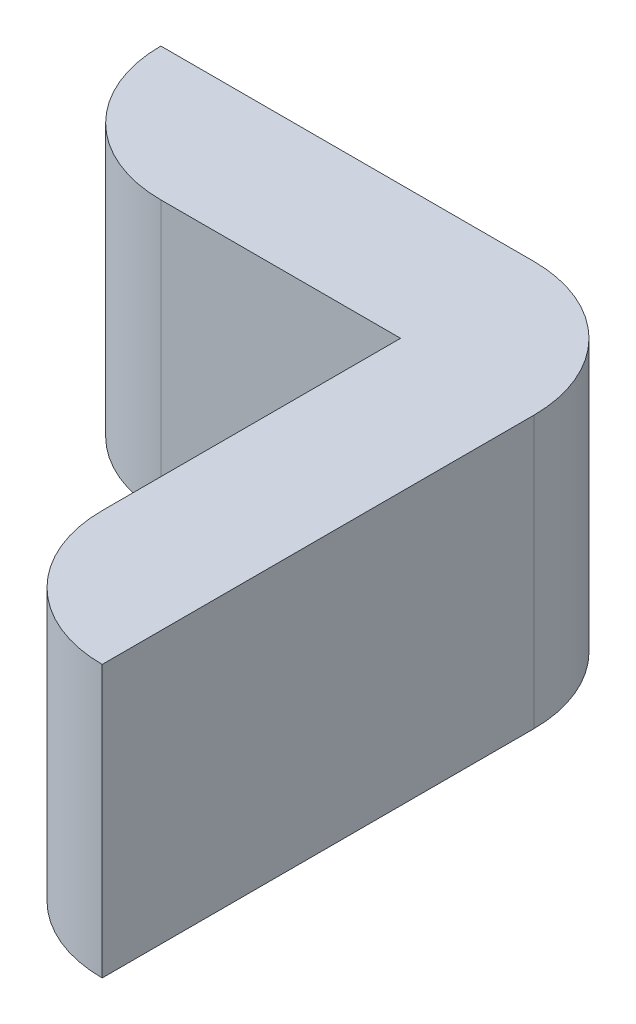
ISO-10303-21;
HEADER;
FILE_DESCRIPTION(('STEP AP214'),'2;1');
FILE_NAME('part.step','',(''),(''),'','','');
FILE_SCHEMA(('AUTOMOTIVE_DESIGN { 1 0 10303 214 1 1 1 1 }'));
ENDSEC;
DATA;
#1=APPLICATION_CONTEXT('core data for automotive mechanical design processes');
#2=APPLICATION_PROTOCOL_DEFINITION('international standard','automotive_design',2000,#1);
#3=PRODUCT_CONTEXT('',#1,'mechanical');
#4=PRODUCT('Part','Part','',(#3));
#5=PRODUCT_RELATED_PRODUCT_CATEGORY('part','',(#4));
#6=PRODUCT_DEFINITION_FORMATION('','',#4);
#7=PRODUCT_DEFINITION_CONTEXT('part definition',#1,'design');
#8=PRODUCT_DEFINITION('design','',#6,#7);
#9=PRODUCT_DEFINITION_SHAPE('','',#8);
#10=(LENGTH_UNIT() NAMED_UNIT(*) SI_UNIT(.MILLI.,.METRE.));
#11=(NAMED_UNIT(*) PLANE_ANGLE_UNIT() SI_UNIT($,.RADIAN.));
#12=(NAMED_UNIT(*) SI_UNIT($,.STERADIAN.) SOLID_ANGLE_UNIT());
#13=UNCERTAINTY_MEASURE_WITH_UNIT(LENGTH_MEASURE(1.E-05),#10,'distance_accuracy_value','');
#14=(GEOMETRIC_REPRESENTATION_CONTEXT(3) GLOBAL_UNCERTAINTY_ASSIGNED_CONTEXT((#13)) GLOBAL_UNIT_ASSIGNED_CONTEXT((#10,
#11,#12)) REPRESENTATION_CONTEXT('',''));
#15=CARTESIAN_POINT('',(0.,0.,0.));
#16=DIRECTION('',(0.,0.,1.));
#17=DIRECTION('',(1.,0.,0.));
#18=AXIS2_PLACEMENT_3D('',#15,#16,#17);
#19=CARTESIAN_POINT('',(5.275,-2.2852,0.));
#20=DIRECTION('',(0.,-1.,0.));
#21=DIRECTION('',(0.,0.,-1.));
#22=AXIS2_PLACEMENT_3D('',#19,#20,#21);
#23=PLANE('',#22);
#24=DIRECTION('',(-1.,0.,0.));
#25=VECTOR('',#24,1.);
#26=CARTESIAN_POINT('',(5.525,-2.2852,0.25));
#27=LINE('',#26,#25);
#28=CARTESIAN_POINT('',(5.525,-2.2852,0.25));
#29=VERTEX_POINT('',#28);
#30=CARTESIAN_POINT('',(5.975,-2.2852,0.25));
#31=VERTEX_POINT('',#30);
#32=EDGE_CURVE('E103',#29,#31,#27,.F.);
#33=ORIENTED_EDGE('',*,*,#32,.T.);
#34=DIRECTION('',(0.,0.,-1.));
#35=VECTOR('',#34,1.);
#36=CARTESIAN_POINT('',(5.975,-2.2852,0.25));
#37=LINE('',#36,#35);
#38=CARTESIAN_POINT('',(5.975,-2.2852,0.81));
#39=VERTEX_POINT('',#38);
#40=EDGE_CURVE('E109',#31,#39,#37,.F.);
#41=ORIENTED_EDGE('',*,*,#40,.T.);
#42=CARTESIAN_POINT('',(6.225,-2.2852,0.81));
#43=DIRECTION('',(0.,-1.,0.));
#44=DIRECTION('',(0.,0.,-1.));
#45=AXIS2_PLACEMENT_3D('',#42,#43,#44);
#46=CIRCLE('',#45,0.25);
#47=CARTESIAN_POINT('',(6.225,-2.2852,1.06));
#48=VERTEX_POINT('',#47);
#49=EDGE_CURVE('E81',#48,#39,#46,.T.);
#50=ORIENTED_EDGE('',*,*,#49,.F.);
#51=DIRECTION('',(0.,0.,1.));
#52=VECTOR('',#51,1.);
#53=CARTESIAN_POINT('',(6.225,-2.2852,1.06));
#54=LINE('',#53,#52);
#55=CARTESIAN_POINT('',(6.225,-2.2852,0.25));
#56=VERTEX_POINT('',#55);
#57=EDGE_CURVE('E76',#48,#56,#54,.F.);
#58=ORIENTED_EDGE('',*,*,#57,.T.);
#59=CARTESIAN_POINT('',(5.975,-2.2852,0.25));
#60=DIRECTION('',(0.,-1.,0.));
#61=DIRECTION('',(0.,0.,-1.));
#62=AXIS2_PLACEMENT_3D('',#59,#60,#61);
#63=CIRCLE('',#62,0.25);
#64=CARTESIAN_POINT('',(5.975,-2.2852,0.));
#65=VERTEX_POINT('',#64);
#66=EDGE_CURVE('E20',#65,#56,#63,.T.);
#67=ORIENTED_EDGE('',*,*,#66,.F.);
#68=DIRECTION('',(1.,0.,0.));
#69=VECTOR('',#68,1.);
#70=CARTESIAN_POINT('',(5.975,-2.2852,0.));
#71=LINE('',#70,#69);
#72=CARTESIAN_POINT('',(5.275,-2.2852,0.));
#73=VERTEX_POINT('',#72);
#74=EDGE_CURVE('E71',#65,#73,#71,.F.);
#75=ORIENTED_EDGE('',*,*,#74,.T.);
#76=CARTESIAN_POINT('',(5.525,-2.2852,0.));
#77=DIRECTION('',(0.,-1.,0.));
#78=DIRECTION('',(0.,0.,-1.));
#79=AXIS2_PLACEMENT_3D('',#76,#77,#78);
#80=CIRCLE('',#79,0.25);
#81=EDGE_CURVE('E122',#29,#73,#80,.T.);
#82=ORIENTED_EDGE('',*,*,#81,.F.);
#83=EDGE_LOOP('',(#33,#41,#50,#58,#67,#75,#82));
#84=FACE_BOUND('',#83,.T.);
#85=ADVANCED_FACE('F17',(#84),#23,.F.);
#86=CARTESIAN_POINT('',(5.975,-2.7948,0.));
#87=DIRECTION('',(0.,0.,1.));
#88=DIRECTION('',(1.,0.,0.));
#89=AXIS2_PLACEMENT_3D('',#86,#87,#88);
#90=PLANE('',#89);
#91=DIRECTION('',(0.,-1.,0.));
#92=VECTOR('',#91,1.);
#93=CARTESIAN_POINT('',(5.275,-2.7948,0.));
#94=LINE('',#93,#92);
#95=CARTESIAN_POINT('',(5.275,-2.7948,0.));
#96=VERTEX_POINT('',#95);
#97=EDGE_CURVE('E124',#73,#96,#94,.T.);
#98=ORIENTED_EDGE('',*,*,#97,.F.);
#99=ORIENTED_EDGE('',*,*,#74,.F.);
#100=DIRECTION('',(0.,-1.,0.));
#101=VECTOR('',#100,1.);
#102=CARTESIAN_POINT('',(5.975,-2.7948,0.));
#103=LINE('',#102,#101);
#104=CARTESIAN_POINT('',(5.975,-2.7948,0.));
#105=VERTEX_POINT('',#104);
#106=EDGE_CURVE('E93',#105,#65,#103,.F.);
#107=ORIENTED_EDGE('',*,*,#106,.F.);
#108=DIRECTION('',(1.,0.,0.));
#109=VECTOR('',#108,1.);
#110=CARTESIAN_POINT('',(5.275,-2.7948,0.));
#111=LINE('',#110,#109);
#112=EDGE_CURVE('E121',#96,#105,#111,.T.);
#113=ORIENTED_EDGE('',*,*,#112,.F.);
#114=EDGE_LOOP('',(#98,#99,#107,#113));
#115=FACE_BOUND('',#114,.T.);
#116=ADVANCED_FACE('F159',(#115),#90,.F.);
#117=CARTESIAN_POINT('',(5.975,-2.7948,0.25));
#118=DIRECTION('',(0.,-1.,0.));
#119=DIRECTION('',(0.,0.,-1.));
#120=AXIS2_PLACEMENT_3D('',#117,#118,#119);
#121=CYLINDRICAL_SURFACE('',#120,0.25);
#122=ORIENTED_EDGE('',*,*,#66,.T.);
#123=DIRECTION('',(0.,1.,0.));
#124=VECTOR('',#123,1.);
#125=CARTESIAN_POINT('',(6.225,-2.7948,0.25));
#126=LINE('',#125,#124);
#127=CARTESIAN_POINT('',(6.225,-2.7948,0.25));
#128=VERTEX_POINT('',#127);
#129=EDGE_CURVE('E87',#56,#128,#126,.F.);
#130=ORIENTED_EDGE('',*,*,#129,.T.);
#131=CARTESIAN_POINT('',(5.975,-2.7948,0.25));
#132=DIRECTION('',(0.,-1.,0.));
#133=DIRECTION('',(0.,0.,-1.));
#134=AXIS2_PLACEMENT_3D('',#131,#132,#133);
#135=CIRCLE('',#134,0.25);
#136=EDGE_CURVE('E119',#105,#128,#135,.T.);
#137=ORIENTED_EDGE('',*,*,#136,.F.);
#138=ORIENTED_EDGE('',*,*,#106,.T.);
#139=EDGE_LOOP('',(#122,#130,#137,#138));
#140=FACE_BOUND('',#139,.T.);
#141=ADVANCED_FACE('F90',(#140),#121,.T.);
#142=CARTESIAN_POINT('',(6.225,-2.7948,1.06));
#143=DIRECTION('',(-1.,0.,0.));
#144=DIRECTION('',(0.,0.,1.));
#145=AXIS2_PLACEMENT_3D('',#142,#143,#144);
#146=PLANE('',#145);
#147=DIRECTION('',(0.,-1.,0.));
#148=VECTOR('',#147,1.);
#149=CARTESIAN_POINT('',(6.225,-2.7948,1.06));
#150=LINE('',#149,#148);
#151=CARTESIAN_POINT('',(6.225,-2.7948,1.06));
#152=VERTEX_POINT('',#151);
#153=EDGE_CURVE('E86',#152,#48,#150,.F.);
#154=ORIENTED_EDGE('',*,*,#153,.F.);
#155=DIRECTION('',(0.,0.,-1.));
#156=VECTOR('',#155,1.);
#157=CARTESIAN_POINT('',(6.225,-2.7948,0.));
#158=LINE('',#157,#156);
#159=EDGE_CURVE('E95',#128,#152,#158,.F.);
#160=ORIENTED_EDGE('',*,*,#159,.F.);
#161=ORIENTED_EDGE('',*,*,#129,.F.);
#162=ORIENTED_EDGE('',*,*,#57,.F.);
#163=EDGE_LOOP('',(#154,#160,#161,#162));
#164=FACE_BOUND('',#163,.T.);
#165=ADVANCED_FACE('F94',(#164),#146,.F.);
#166=CARTESIAN_POINT('',(6.225,-2.7948,0.81));
#167=DIRECTION('',(0.,-1.,0.));
#168=DIRECTION('',(0.,0.,-1.));
#169=AXIS2_PLACEMENT_3D('',#166,#167,#168);
#170=CYLINDRICAL_SURFACE('',#169,0.25);
#171=ORIENTED_EDGE('',*,*,#49,.T.);
#172=DIRECTION('',(0.,1.,0.));
#173=VECTOR('',#172,1.);
#174=CARTESIAN_POINT('',(5.975,-2.7948,0.81));
#175=LINE('',#174,#173);
#176=CARTESIAN_POINT('',(5.975,-2.7948,0.81));
#177=VERTEX_POINT('',#176);
#178=EDGE_CURVE('E106',#39,#177,#175,.F.);
#179=ORIENTED_EDGE('',*,*,#178,.T.);
#180=CARTESIAN_POINT('',(6.225,-2.7948,0.81));
#181=DIRECTION('',(0.,-1.,0.));
#182=DIRECTION('',(0.,0.,-1.));
#183=AXIS2_PLACEMENT_3D('',#180,#181,#182);
#184=CIRCLE('',#183,0.25);
#185=EDGE_CURVE('E115',#152,#177,#184,.T.);
#186=ORIENTED_EDGE('',*,*,#185,.F.);
#187=ORIENTED_EDGE('',*,*,#153,.T.);
#188=EDGE_LOOP('',(#171,#179,#186,#187));
#189=FACE_BOUND('',#188,.T.);
#190=ADVANCED_FACE('F128',(#189),#170,.T.);
#191=CARTESIAN_POINT('',(5.975,-2.7948,0.25));
#192=DIRECTION('',(1.,0.,0.));
#193=DIRECTION('',(0.,0.,-1.));
#194=AXIS2_PLACEMENT_3D('',#191,#192,#193);
#195=PLANE('',#194);
#196=ORIENTED_EDGE('',*,*,#178,.F.);
#197=ORIENTED_EDGE('',*,*,#40,.F.);
#198=DIRECTION('',(0.,1.,0.));
#199=VECTOR('',#198,1.);
#200=CARTESIAN_POINT('',(5.975,-2.7948,0.25));
#201=LINE('',#200,#199);
#202=CARTESIAN_POINT('',(5.975,-2.7948,0.25));
#203=VERTEX_POINT('',#202);
#204=EDGE_CURVE('E105',#31,#203,#201,.F.);
#205=ORIENTED_EDGE('',*,*,#204,.T.);
#206=DIRECTION('',(0.,0.,-1.));
#207=VECTOR('',#206,1.);
#208=CARTESIAN_POINT('',(5.975,-2.7948,0.));
#209=LINE('',#208,#207);
#210=EDGE_CURVE('E118',#177,#203,#209,.T.);
#211=ORIENTED_EDGE('',*,*,#210,.F.);
#212=EDGE_LOOP('',(#196,#197,#205,#211));
#213=FACE_BOUND('',#212,.T.);
#214=ADVANCED_FACE('F151',(#213),#195,.F.);
#215=CARTESIAN_POINT('',(5.525,-2.7948,0.25));
#216=DIRECTION('',(0.,0.,-1.));
#217=DIRECTION('',(-1.,0.,0.));
#218=AXIS2_PLACEMENT_3D('',#215,#216,#217);
#219=PLANE('',#218);
#220=ORIENTED_EDGE('',*,*,#204,.F.);
#221=ORIENTED_EDGE('',*,*,#32,.F.);
#222=DIRECTION('',(0.,-1.,0.));
#223=VECTOR('',#222,1.);
#224=CARTESIAN_POINT('',(5.525,-2.7948,0.25));
#225=LINE('',#224,#223);
#226=CARTESIAN_POINT('',(5.525,-2.7948,0.25));
#227=VERTEX_POINT('',#226);
#228=EDGE_CURVE('E35',#227,#29,#225,.F.);
#229=ORIENTED_EDGE('',*,*,#228,.F.);
#230=DIRECTION('',(1.,0.,0.));
#231=VECTOR('',#230,1.);
#232=CARTESIAN_POINT('',(5.275,-2.7948,0.25));
#233=LINE('',#232,#231);
#234=EDGE_CURVE('E26',#203,#227,#233,.F.);
#235=ORIENTED_EDGE('',*,*,#234,.F.);
#236=EDGE_LOOP('',(#220,#221,#229,#235));
#237=FACE_BOUND('',#236,.T.);
#238=ADVANCED_FACE('F152',(#237),#219,.F.);
#239=CARTESIAN_POINT('',(5.525,-2.7948,0.));
#240=DIRECTION('',(0.,-1.,0.));
#241=DIRECTION('',(0.,0.,-1.));
#242=AXIS2_PLACEMENT_3D('',#239,#240,#241);
#243=CYLINDRICAL_SURFACE('',#242,0.25);
#244=ORIENTED_EDGE('',*,*,#81,.T.);
#245=ORIENTED_EDGE('',*,*,#97,.T.);
#246=CARTESIAN_POINT('',(5.525,-2.7948,0.));
#247=DIRECTION('',(0.,-1.,0.));
#248=DIRECTION('',(0.,0.,-1.));
#249=AXIS2_PLACEMENT_3D('',#246,#247,#248);
#250=CIRCLE('',#249,0.25);
#251=EDGE_CURVE('E11',#227,#96,#250,.T.);
#252=ORIENTED_EDGE('',*,*,#251,.F.);
#253=ORIENTED_EDGE('',*,*,#228,.T.);
#254=EDGE_LOOP('',(#244,#245,#252,#253));
#255=FACE_BOUND('',#254,.T.);
#256=ADVANCED_FACE('F157',(#255),#243,.T.);
#257=CARTESIAN_POINT('',(5.275,-2.7948,0.));
#258=DIRECTION('',(0.,-1.,0.));
#259=DIRECTION('',(0.,0.,-1.));
#260=AXIS2_PLACEMENT_3D('',#257,#258,#259);
#261=PLANE('',#260);
#262=ORIENTED_EDGE('',*,*,#234,.T.);
#263=ORIENTED_EDGE('',*,*,#251,.T.);
#264=ORIENTED_EDGE('',*,*,#112,.T.);
#265=ORIENTED_EDGE('',*,*,#136,.T.);
#266=ORIENTED_EDGE('',*,*,#159,.T.);
#267=ORIENTED_EDGE('',*,*,#185,.T.);
#268=ORIENTED_EDGE('',*,*,#210,.T.);
#269=EDGE_LOOP('',(#262,#263,#264,#265,#266,#267,#268));
#270=FACE_BOUND('',#269,.T.);
#271=ADVANCED_FACE('F133',(#270),#261,.T.);
#272=CLOSED_SHELL('',(#85,#116,#141,#165,#190,#214,#238,#256,#271));
#273=MANIFOLD_SOLID_BREP('B1',#272);
#274=ADVANCED_BREP_SHAPE_REPRESENTATION('',(#18,#273),#14);
#275=SHAPE_DEFINITION_REPRESENTATION(#9,#274);
ENDSEC;
END-ISO-10303-21;
